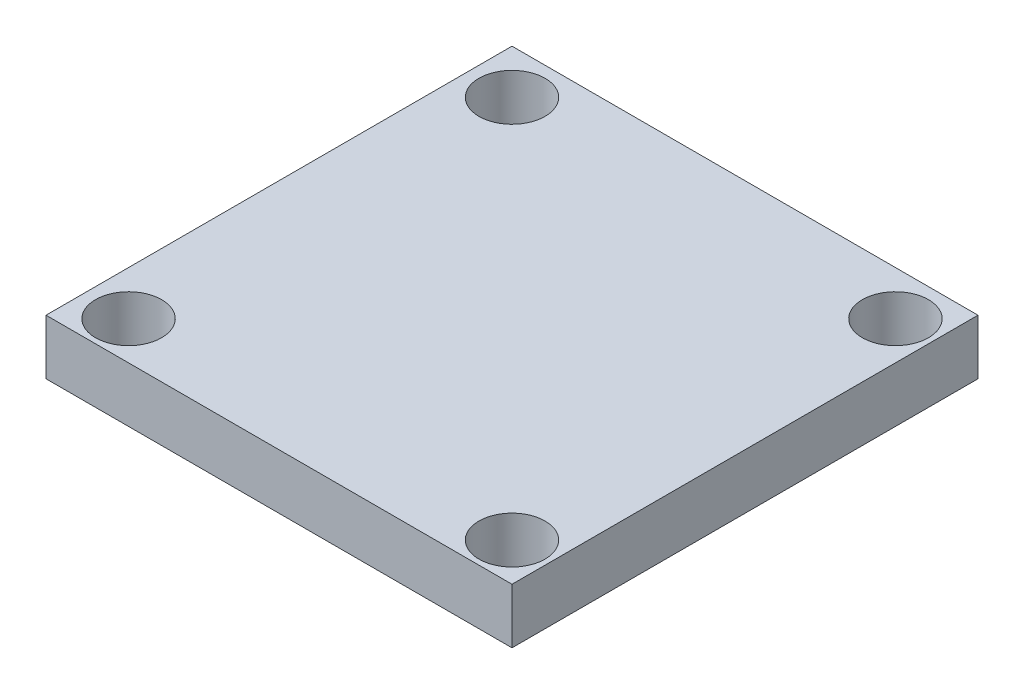
ISO-10303-21;
HEADER;
FILE_DESCRIPTION(('STEP AP214'),'2;1');
FILE_NAME('part.step','',(''),(''),'','','');
FILE_SCHEMA(('AUTOMOTIVE_DESIGN { 1 0 10303 214 1 1 1 1 }'));
ENDSEC;
DATA;
#1=APPLICATION_CONTEXT('core data for automotive mechanical design processes');
#2=APPLICATION_PROTOCOL_DEFINITION('international standard','automotive_design',2000,#1);
#3=PRODUCT_CONTEXT('',#1,'mechanical');
#4=PRODUCT('Part','Part','',(#3));
#5=PRODUCT_RELATED_PRODUCT_CATEGORY('part','',(#4));
#6=PRODUCT_DEFINITION_FORMATION('','',#4);
#7=PRODUCT_DEFINITION_CONTEXT('part definition',#1,'design');
#8=PRODUCT_DEFINITION('design','',#6,#7);
#9=PRODUCT_DEFINITION_SHAPE('','',#8);
#10=(LENGTH_UNIT() NAMED_UNIT(*) SI_UNIT(.MILLI.,.METRE.));
#11=(NAMED_UNIT(*) PLANE_ANGLE_UNIT() SI_UNIT($,.RADIAN.));
#12=(NAMED_UNIT(*) SI_UNIT($,.STERADIAN.) SOLID_ANGLE_UNIT());
#13=UNCERTAINTY_MEASURE_WITH_UNIT(LENGTH_MEASURE(1.E-05),#10,'distance_accuracy_value','');
#14=(GEOMETRIC_REPRESENTATION_CONTEXT(3) GLOBAL_UNCERTAINTY_ASSIGNED_CONTEXT((#13)) GLOBAL_UNIT_ASSIGNED_CONTEXT((#10,
#11,#12)) REPRESENTATION_CONTEXT('',''));
#15=CARTESIAN_POINT('',(0.,0.,0.));
#16=DIRECTION('',(0.,0.,1.));
#17=DIRECTION('',(1.,0.,0.));
#18=AXIS2_PLACEMENT_3D('',#15,#16,#17);
#19=CARTESIAN_POINT('',(21.15,5.,21.15));
#20=DIRECTION('',(-1.,0.,0.));
#21=DIRECTION('',(0.,0.,1.));
#22=AXIS2_PLACEMENT_3D('',#19,#20,#21);
#23=PLANE('',#22);
#24=DIRECTION('',(0.,0.,-1.));
#25=VECTOR('',#24,1.);
#26=CARTESIAN_POINT('',(21.15,0.,21.15));
#27=LINE('',#26,#25);
#28=CARTESIAN_POINT('',(21.15,0.,21.15));
#29=VERTEX_POINT('',#28);
#30=CARTESIAN_POINT('',(21.15,0.,-21.15));
#31=VERTEX_POINT('',#30);
#32=EDGE_CURVE('E113',#29,#31,#27,.T.);
#33=ORIENTED_EDGE('',*,*,#32,.T.);
#34=DIRECTION('',(0.,-1.,0.));
#35=VECTOR('',#34,1.);
#36=CARTESIAN_POINT('',(21.15,5.,-21.15));
#37=LINE('',#36,#35);
#38=CARTESIAN_POINT('',(21.15,5.,-21.15));
#39=VERTEX_POINT('',#38);
#40=EDGE_CURVE('E11',#39,#31,#37,.T.);
#41=ORIENTED_EDGE('',*,*,#40,.F.);
#42=DIRECTION('',(0.,0.,-1.));
#43=VECTOR('',#42,1.);
#44=CARTESIAN_POINT('',(21.15,5.,21.15));
#45=LINE('',#44,#43);
#46=CARTESIAN_POINT('',(21.15,5.,21.15));
#47=VERTEX_POINT('',#46);
#48=EDGE_CURVE('E97',#47,#39,#45,.T.);
#49=ORIENTED_EDGE('',*,*,#48,.F.);
#50=DIRECTION('',(0.,-1.,0.));
#51=VECTOR('',#50,1.);
#52=CARTESIAN_POINT('',(21.15,5.,21.15));
#53=LINE('',#52,#51);
#54=EDGE_CURVE('E109',#47,#29,#53,.T.);
#55=ORIENTED_EDGE('',*,*,#54,.T.);
#56=EDGE_LOOP('',(#33,#41,#49,#55));
#57=FACE_BOUND('',#56,.T.);
#58=ADVANCED_FACE('F45',(#57),#23,.F.);
#59=CARTESIAN_POINT('',(-21.15,5.,-21.15));
#60=DIRECTION('',(0.,0.,1.));
#61=DIRECTION('',(1.,0.,0.));
#62=AXIS2_PLACEMENT_3D('',#59,#60,#61);
#63=PLANE('',#62);
#64=DIRECTION('',(-1.,0.,0.));
#65=VECTOR('',#64,1.);
#66=CARTESIAN_POINT('',(-21.15,0.,-21.15));
#67=LINE('',#66,#65);
#68=CARTESIAN_POINT('',(-21.15,0.,-21.15));
#69=VERTEX_POINT('',#68);
#70=EDGE_CURVE('E102',#31,#69,#67,.T.);
#71=ORIENTED_EDGE('',*,*,#70,.T.);
#72=DIRECTION('',(0.,-1.,0.));
#73=VECTOR('',#72,1.);
#74=CARTESIAN_POINT('',(-21.15,5.,-21.15));
#75=LINE('',#74,#73);
#76=CARTESIAN_POINT('',(-21.15,5.,-21.15));
#77=VERTEX_POINT('',#76);
#78=EDGE_CURVE('E54',#77,#69,#75,.T.);
#79=ORIENTED_EDGE('',*,*,#78,.F.);
#80=DIRECTION('',(-1.,0.,0.));
#81=VECTOR('',#80,1.);
#82=CARTESIAN_POINT('',(-21.15,5.,-21.15));
#83=LINE('',#82,#81);
#84=EDGE_CURVE('E92',#39,#77,#83,.T.);
#85=ORIENTED_EDGE('',*,*,#84,.F.);
#86=ORIENTED_EDGE('',*,*,#40,.T.);
#87=EDGE_LOOP('',(#71,#79,#85,#86));
#88=FACE_BOUND('',#87,.T.);
#89=ADVANCED_FACE('F101',(#88),#63,.F.);
#90=CARTESIAN_POINT('',(-21.15,5.,21.15));
#91=DIRECTION('',(1.,0.,0.));
#92=DIRECTION('',(0.,0.,-1.));
#93=AXIS2_PLACEMENT_3D('',#90,#91,#92);
#94=PLANE('',#93);
#95=DIRECTION('',(0.,0.,1.));
#96=VECTOR('',#95,1.);
#97=CARTESIAN_POINT('',(-21.15,0.,21.15));
#98=LINE('',#97,#96);
#99=CARTESIAN_POINT('',(-21.15,0.,21.15));
#100=VERTEX_POINT('',#99);
#101=EDGE_CURVE('E79',#69,#100,#98,.T.);
#102=ORIENTED_EDGE('',*,*,#101,.T.);
#103=DIRECTION('',(0.,-1.,0.));
#104=VECTOR('',#103,1.);
#105=CARTESIAN_POINT('',(-21.15,5.,21.15));
#106=LINE('',#105,#104);
#107=CARTESIAN_POINT('',(-21.15,5.,21.15));
#108=VERTEX_POINT('',#107);
#109=EDGE_CURVE('E104',#108,#100,#106,.T.);
#110=ORIENTED_EDGE('',*,*,#109,.F.);
#111=DIRECTION('',(0.,0.,1.));
#112=VECTOR('',#111,1.);
#113=CARTESIAN_POINT('',(-21.15,5.,21.15));
#114=LINE('',#113,#112);
#115=EDGE_CURVE('E95',#77,#108,#114,.T.);
#116=ORIENTED_EDGE('',*,*,#115,.F.);
#117=ORIENTED_EDGE('',*,*,#78,.T.);
#118=EDGE_LOOP('',(#102,#110,#116,#117));
#119=FACE_BOUND('',#118,.T.);
#120=ADVANCED_FACE('F105',(#119),#94,.F.);
#121=CARTESIAN_POINT('',(-21.15,5.,21.15));
#122=DIRECTION('',(0.,0.,-1.));
#123=DIRECTION('',(-1.,0.,0.));
#124=AXIS2_PLACEMENT_3D('',#121,#122,#123);
#125=PLANE('',#124);
#126=DIRECTION('',(1.,0.,0.));
#127=VECTOR('',#126,1.);
#128=CARTESIAN_POINT('',(-21.15,0.,21.15));
#129=LINE('',#128,#127);
#130=EDGE_CURVE('E85',#100,#29,#129,.T.);
#131=ORIENTED_EDGE('',*,*,#130,.T.);
#132=ORIENTED_EDGE('',*,*,#54,.F.);
#133=DIRECTION('',(1.,0.,0.));
#134=VECTOR('',#133,1.);
#135=CARTESIAN_POINT('',(-21.15,5.,21.15));
#136=LINE('',#135,#134);
#137=EDGE_CURVE('E62',#108,#47,#136,.T.);
#138=ORIENTED_EDGE('',*,*,#137,.F.);
#139=ORIENTED_EDGE('',*,*,#109,.T.);
#140=EDGE_LOOP('',(#131,#132,#138,#139));
#141=FACE_BOUND('',#140,.T.);
#142=ADVANCED_FACE('F127',(#141),#125,.F.);
#143=CARTESIAN_POINT('',(0.,5.,0.));
#144=DIRECTION('',(0.,-1.,0.));
#145=DIRECTION('',(0.,0.,-1.));
#146=AXIS2_PLACEMENT_3D('',#143,#144,#145);
#147=PLANE('',#146);
#148=CARTESIAN_POINT('',(-17.1273581591284,5.,17.6773415038885));
#149=DIRECTION('',(0.,1.,0.));
#150=DIRECTION('',(1.,0.,0.));
#151=AXIS2_PLACEMENT_3D('',#148,#149,#150);
#152=CIRCLE('',#151,3.);
#153=CARTESIAN_POINT('',(-14.1273581591284,5.,17.6773415038885));
#154=VERTEX_POINT('',#153);
#155=EDGE_CURVE('E158',#154,#154,#152,.T.);
#156=ORIENTED_EDGE('',*,*,#155,.F.);
#157=EDGE_LOOP('',(#156));
#158=FACE_BOUND('',#157,.T.);
#159=CARTESIAN_POINT('',(17.6773415038884,5.,17.6773415038884));
#160=DIRECTION('',(0.,1.,0.));
#161=DIRECTION('',(0.,0.,-1.));
#162=AXIS2_PLACEMENT_3D('',#159,#160,#161);
#163=CIRCLE('',#162,3.);
#164=CARTESIAN_POINT('',(17.6773415038884,5.,14.6773415038885));
#165=VERTEX_POINT('',#164);
#166=EDGE_CURVE('E150',#165,#165,#163,.T.);
#167=ORIENTED_EDGE('',*,*,#166,.F.);
#168=EDGE_LOOP('',(#167));
#169=FACE_BOUND('',#168,.T.);
#170=CARTESIAN_POINT('',(17.6773415038883,5.,-17.1273581591286));
#171=DIRECTION('',(0.,1.,0.));
#172=DIRECTION('',(-1.,0.,0.));
#173=AXIS2_PLACEMENT_3D('',#170,#171,#172);
#174=CIRCLE('',#173,3.);
#175=CARTESIAN_POINT('',(14.6773415038883,5.,-17.1273581591286));
#176=VERTEX_POINT('',#175);
#177=EDGE_CURVE('E142',#176,#176,#174,.T.);
#178=ORIENTED_EDGE('',*,*,#177,.F.);
#179=EDGE_LOOP('',(#178));
#180=FACE_BOUND('',#179,.T.);
#181=CARTESIAN_POINT('',(-17.1273581591285,5.,-17.1273581591285));
#182=DIRECTION('',(0.,1.,0.));
#183=DIRECTION('',(0.,0.,1.));
#184=AXIS2_PLACEMENT_3D('',#181,#182,#183);
#185=CIRCLE('',#184,3.);
#186=CARTESIAN_POINT('',(-17.1273581591285,5.,-14.1273581591285));
#187=VERTEX_POINT('',#186);
#188=EDGE_CURVE('E134',#187,#187,#185,.T.);
#189=ORIENTED_EDGE('',*,*,#188,.F.);
#190=EDGE_LOOP('',(#189));
#191=FACE_BOUND('',#190,.T.);
#192=ORIENTED_EDGE('',*,*,#48,.T.);
#193=ORIENTED_EDGE('',*,*,#84,.T.);
#194=ORIENTED_EDGE('',*,*,#115,.T.);
#195=ORIENTED_EDGE('',*,*,#137,.T.);
#196=EDGE_LOOP('',(#192,#193,#194,#195));
#197=FACE_BOUND('',#196,.T.);
#198=ADVANCED_FACE('F93',(#158,#169,#180,#191,#197),#147,.F.);
#199=CARTESIAN_POINT('',(0.,0.,0.));
#200=DIRECTION('',(0.,-1.,0.));
#201=DIRECTION('',(0.,0.,-1.));
#202=AXIS2_PLACEMENT_3D('',#199,#200,#201);
#203=PLANE('',#202);
#204=CARTESIAN_POINT('',(-17.1273581591284,0.,17.6773415038885));
#205=DIRECTION('',(0.,1.,0.));
#206=DIRECTION('',(1.,0.,0.));
#207=AXIS2_PLACEMENT_3D('',#204,#205,#206);
#208=CIRCLE('',#207,3.);
#209=CARTESIAN_POINT('',(-14.1273581591284,0.,17.6773415038885));
#210=VERTEX_POINT('',#209);
#211=EDGE_CURVE('E138',#210,#210,#208,.T.);
#212=ORIENTED_EDGE('',*,*,#211,.T.);
#213=EDGE_LOOP('',(#212));
#214=FACE_BOUND('',#213,.T.);
#215=CARTESIAN_POINT('',(17.6773415038884,0.,17.6773415038884));
#216=DIRECTION('',(0.,1.,0.));
#217=DIRECTION('',(0.,0.,-1.));
#218=AXIS2_PLACEMENT_3D('',#215,#216,#217);
#219=CIRCLE('',#218,3.);
#220=CARTESIAN_POINT('',(17.6773415038884,0.,14.6773415038885));
#221=VERTEX_POINT('',#220);
#222=EDGE_CURVE('E154',#221,#221,#219,.T.);
#223=ORIENTED_EDGE('',*,*,#222,.T.);
#224=EDGE_LOOP('',(#223));
#225=FACE_BOUND('',#224,.T.);
#226=CARTESIAN_POINT('',(17.6773415038883,0.,-17.1273581591286));
#227=DIRECTION('',(0.,1.,0.));
#228=DIRECTION('',(-1.,0.,0.));
#229=AXIS2_PLACEMENT_3D('',#226,#227,#228);
#230=CIRCLE('',#229,3.);
#231=CARTESIAN_POINT('',(14.6773415038883,0.,-17.1273581591286));
#232=VERTEX_POINT('',#231);
#233=EDGE_CURVE('E146',#232,#232,#230,.T.);
#234=ORIENTED_EDGE('',*,*,#233,.T.);
#235=EDGE_LOOP('',(#234));
#236=FACE_BOUND('',#235,.T.);
#237=CARTESIAN_POINT('',(-17.1273581591285,0.,-17.1273581591285));
#238=DIRECTION('',(0.,1.,0.));
#239=DIRECTION('',(0.,0.,1.));
#240=AXIS2_PLACEMENT_3D('',#237,#238,#239);
#241=CIRCLE('',#240,3.);
#242=CARTESIAN_POINT('',(-17.1273581591285,0.,-14.1273581591285));
#243=VERTEX_POINT('',#242);
#244=EDGE_CURVE('E117',#243,#243,#241,.T.);
#245=ORIENTED_EDGE('',*,*,#244,.T.);
#246=EDGE_LOOP('',(#245));
#247=FACE_BOUND('',#246,.T.);
#248=ORIENTED_EDGE('',*,*,#32,.F.);
#249=ORIENTED_EDGE('',*,*,#130,.F.);
#250=ORIENTED_EDGE('',*,*,#101,.F.);
#251=ORIENTED_EDGE('',*,*,#70,.F.);
#252=EDGE_LOOP('',(#248,#249,#250,#251));
#253=FACE_BOUND('',#252,.T.);
#254=ADVANCED_FACE('F130',(#214,#225,#236,#247,#253),#203,.T.);
#255=CARTESIAN_POINT('',(-17.1273581591285,0.,-17.1273581591285));
#256=DIRECTION('',(0.,1.,0.));
#257=DIRECTION('',(0.,0.,1.));
#258=AXIS2_PLACEMENT_3D('',#255,#256,#257);
#259=CYLINDRICAL_SURFACE('',#258,3.);
#260=ORIENTED_EDGE('',*,*,#244,.F.);
#261=EDGE_LOOP('',(#260));
#262=FACE_BOUND('',#261,.T.);
#263=ORIENTED_EDGE('',*,*,#188,.T.);
#264=EDGE_LOOP('',(#263));
#265=FACE_BOUND('',#264,.T.);
#266=ADVANCED_FACE('F184',(#262,#265),#259,.F.);
#267=CARTESIAN_POINT('',(17.6773415038883,0.,-17.1273581591286));
#268=DIRECTION('',(0.,1.,0.));
#269=DIRECTION('',(0.,0.,1.));
#270=AXIS2_PLACEMENT_3D('',#267,#268,#269);
#271=CYLINDRICAL_SURFACE('',#270,3.);
#272=ORIENTED_EDGE('',*,*,#233,.F.);
#273=EDGE_LOOP('',(#272));
#274=FACE_BOUND('',#273,.T.);
#275=ORIENTED_EDGE('',*,*,#177,.T.);
#276=EDGE_LOOP('',(#275));
#277=FACE_BOUND('',#276,.T.);
#278=ADVANCED_FACE('F186',(#274,#277),#271,.F.);
#279=CARTESIAN_POINT('',(17.6773415038884,0.,17.6773415038884));
#280=DIRECTION('',(0.,1.,0.));
#281=DIRECTION('',(0.,0.,1.));
#282=AXIS2_PLACEMENT_3D('',#279,#280,#281);
#283=CYLINDRICAL_SURFACE('',#282,3.);
#284=ORIENTED_EDGE('',*,*,#222,.F.);
#285=EDGE_LOOP('',(#284));
#286=FACE_BOUND('',#285,.T.);
#287=ORIENTED_EDGE('',*,*,#166,.T.);
#288=EDGE_LOOP('',(#287));
#289=FACE_BOUND('',#288,.T.);
#290=ADVANCED_FACE('F171',(#286,#289),#283,.F.);
#291=CARTESIAN_POINT('',(-17.1273581591284,0.,17.6773415038885));
#292=DIRECTION('',(0.,1.,0.));
#293=DIRECTION('',(0.,0.,1.));
#294=AXIS2_PLACEMENT_3D('',#291,#292,#293);
#295=CYLINDRICAL_SURFACE('',#294,3.);
#296=ORIENTED_EDGE('',*,*,#211,.F.);
#297=EDGE_LOOP('',(#296));
#298=FACE_BOUND('',#297,.T.);
#299=ORIENTED_EDGE('',*,*,#155,.T.);
#300=EDGE_LOOP('',(#299));
#301=FACE_BOUND('',#300,.T.);
#302=ADVANCED_FACE('F168',(#298,#301),#295,.F.);
#303=CLOSED_SHELL('',(#58,#89,#120,#142,#198,#254,#266,#278,#290,#302));
#304=MANIFOLD_SOLID_BREP('B2',#303);
#305=ADVANCED_BREP_SHAPE_REPRESENTATION('',(#18,#304),#14);
#306=SHAPE_DEFINITION_REPRESENTATION(#9,#305);
ENDSEC;
END-ISO-10303-21;
